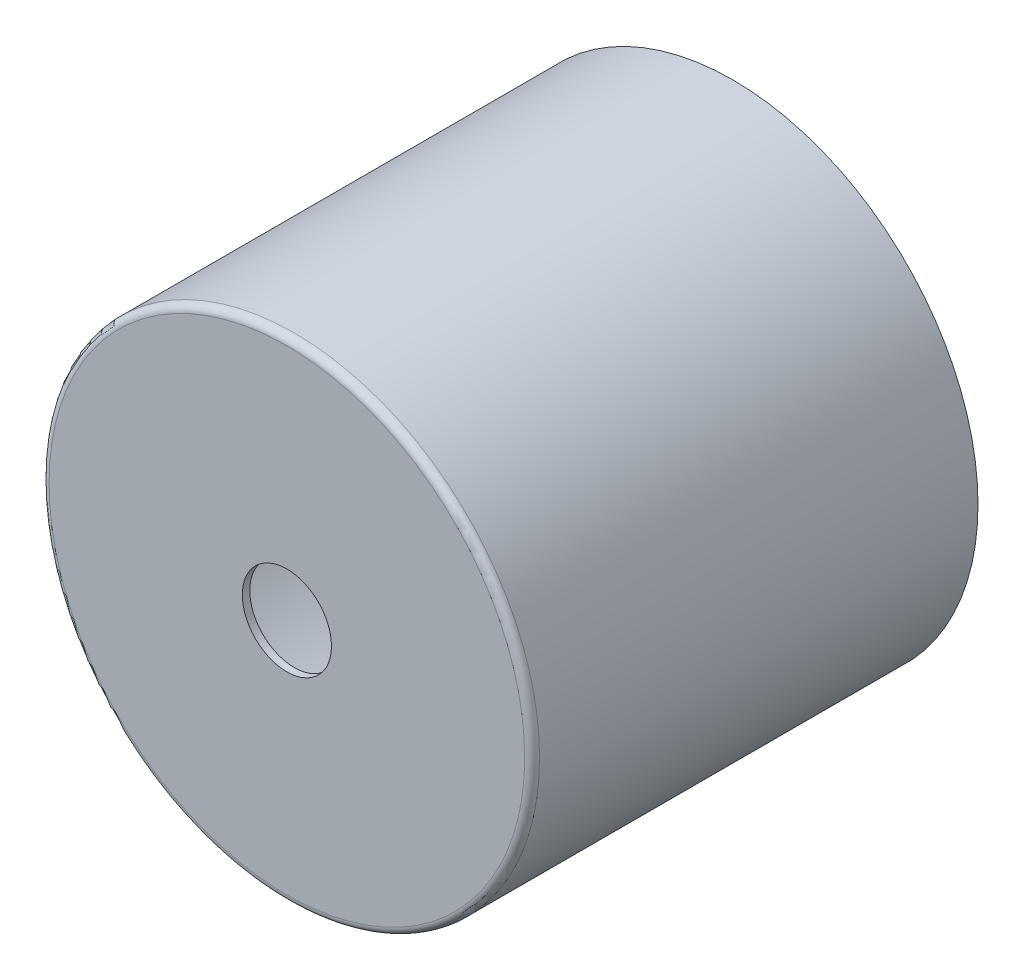
ISO-10303-21;
HEADER;
FILE_DESCRIPTION(('STEP AP214'),'2;1');
FILE_NAME('part.step','',(''),(''),'','','');
FILE_SCHEMA(('AUTOMOTIVE_DESIGN { 1 0 10303 214 1 1 1 1 }'));
ENDSEC;
DATA;
#1=APPLICATION_CONTEXT('core data for automotive mechanical design processes');
#2=APPLICATION_PROTOCOL_DEFINITION('international standard','automotive_design',2000,#1);
#3=PRODUCT_CONTEXT('',#1,'mechanical');
#4=PRODUCT('Part','Part','',(#3));
#5=PRODUCT_RELATED_PRODUCT_CATEGORY('part','',(#4));
#6=PRODUCT_DEFINITION_FORMATION('','',#4);
#7=PRODUCT_DEFINITION_CONTEXT('part definition',#1,'design');
#8=PRODUCT_DEFINITION('design','',#6,#7);
#9=PRODUCT_DEFINITION_SHAPE('','',#8);
#10=(LENGTH_UNIT() NAMED_UNIT(*) SI_UNIT(.MILLI.,.METRE.));
#11=(NAMED_UNIT(*) PLANE_ANGLE_UNIT() SI_UNIT($,.RADIAN.));
#12=(NAMED_UNIT(*) SI_UNIT($,.STERADIAN.) SOLID_ANGLE_UNIT());
#13=UNCERTAINTY_MEASURE_WITH_UNIT(LENGTH_MEASURE(1.E-05),#10,'distance_accuracy_value','');
#14=(GEOMETRIC_REPRESENTATION_CONTEXT(3) GLOBAL_UNCERTAINTY_ASSIGNED_CONTEXT((#13)) GLOBAL_UNIT_ASSIGNED_CONTEXT((#10,
#11,#12)) REPRESENTATION_CONTEXT('',''));
#15=CARTESIAN_POINT('',(0.,0.,0.));
#16=DIRECTION('',(0.,0.,1.));
#17=DIRECTION('',(1.,0.,0.));
#18=AXIS2_PLACEMENT_3D('',#15,#16,#17);
#19=CARTESIAN_POINT('',(0.,0.,-30.));
#20=DIRECTION('',(0.,0.,1.));
#21=DIRECTION('',(1.,0.,0.));
#22=AXIS2_PLACEMENT_3D('',#19,#20,#21);
#23=CYLINDRICAL_SURFACE('',#22,16.5);
#24=CARTESIAN_POINT('',(0.,0.,-0.5));
#25=DIRECTION('',(0.,0.,1.));
#26=DIRECTION('',(1.,0.,0.));
#27=AXIS2_PLACEMENT_3D('',#24,#25,#26);
#28=CIRCLE('',#27,16.5);
#29=CARTESIAN_POINT('',(16.5,0.,-0.5));
#30=VERTEX_POINT('',#29);
#31=EDGE_CURVE('E10',#30,#30,#28,.F.);
#32=ORIENTED_EDGE('',*,*,#31,.T.);
#33=EDGE_LOOP('',(#32));
#34=FACE_BOUND('',#33,.T.);
#35=CARTESIAN_POINT('',(0.,0.,-30.));
#36=DIRECTION('',(0.,0.,1.));
#37=DIRECTION('',(1.,0.,0.));
#38=AXIS2_PLACEMENT_3D('',#35,#36,#37);
#39=CIRCLE('',#38,16.5);
#40=CARTESIAN_POINT('',(16.5,0.,-30.));
#41=VERTEX_POINT('',#40);
#42=EDGE_CURVE('E43',#41,#41,#39,.T.);
#43=ORIENTED_EDGE('',*,*,#42,.T.);
#44=EDGE_LOOP('',(#43));
#45=FACE_BOUND('',#44,.T.);
#46=ADVANCED_FACE('F32',(#34,#45),#23,.T.);
#47=CARTESIAN_POINT('',(0.,0.,-30.));
#48=DIRECTION('',(0.,0.,1.));
#49=DIRECTION('',(1.,0.,0.));
#50=AXIS2_PLACEMENT_3D('',#47,#48,#49);
#51=PLANE('',#50);
#52=CARTESIAN_POINT('',(0.,0.,-30.));
#53=DIRECTION('',(0.,0.,1.));
#54=DIRECTION('',(1.,0.,0.));
#55=AXIS2_PLACEMENT_3D('',#52,#53,#54);
#56=CIRCLE('',#55,16.);
#57=CARTESIAN_POINT('',(16.,0.,-30.));
#58=VERTEX_POINT('',#57);
#59=EDGE_CURVE('E47',#58,#58,#56,.T.);
#60=ORIENTED_EDGE('',*,*,#59,.T.);
#61=EDGE_LOOP('',(#60));
#62=FACE_BOUND('',#61,.T.);
#63=ORIENTED_EDGE('',*,*,#42,.F.);
#64=EDGE_LOOP('',(#63));
#65=FACE_BOUND('',#64,.T.);
#66=ADVANCED_FACE('F68',(#62,#65),#51,.F.);
#67=CARTESIAN_POINT('',(0.,0.,0.));
#68=DIRECTION('',(0.,0.,1.));
#69=DIRECTION('',(1.,0.,0.));
#70=AXIS2_PLACEMENT_3D('',#67,#68,#69);
#71=PLANE('',#70);
#72=CARTESIAN_POINT('',(0.,0.,0.));
#73=DIRECTION('',(0.,0.,1.));
#74=DIRECTION('',(1.,0.,0.));
#75=AXIS2_PLACEMENT_3D('',#72,#73,#74);
#76=CIRCLE('',#75,16.);
#77=CARTESIAN_POINT('',(16.,0.,0.));
#78=VERTEX_POINT('',#77);
#79=EDGE_CURVE('E39',#78,#78,#76,.T.);
#80=ORIENTED_EDGE('',*,*,#79,.T.);
#81=EDGE_LOOP('',(#80));
#82=FACE_BOUND('',#81,.T.);
#83=CARTESIAN_POINT('',(0.,0.,0.));
#84=DIRECTION('',(0.,0.,1.));
#85=DIRECTION('',(1.,0.,0.));
#86=AXIS2_PLACEMENT_3D('',#83,#84,#85);
#87=CIRCLE('',#86,3.);
#88=CARTESIAN_POINT('',(3.,0.,0.));
#89=VERTEX_POINT('',#88);
#90=EDGE_CURVE('E53',#89,#89,#87,.T.);
#91=ORIENTED_EDGE('',*,*,#90,.F.);
#92=EDGE_LOOP('',(#91));
#93=FACE_BOUND('',#92,.T.);
#94=ADVANCED_FACE('F65',(#82,#93),#71,.T.);
#95=CARTESIAN_POINT('',(0.,0.,-30.));
#96=DIRECTION('',(0.,0.,1.));
#97=DIRECTION('',(1.,0.,0.));
#98=AXIS2_PLACEMENT_3D('',#95,#96,#97);
#99=CYLINDRICAL_SURFACE('',#98,16.);
#100=ORIENTED_EDGE('',*,*,#59,.F.);
#101=EDGE_LOOP('',(#100));
#102=FACE_BOUND('',#101,.T.);
#103=CARTESIAN_POINT('',(0.,0.,-0.5));
#104=DIRECTION('',(0.,0.,1.));
#105=DIRECTION('',(1.,0.,0.));
#106=AXIS2_PLACEMENT_3D('',#103,#104,#105);
#107=CIRCLE('',#106,16.);
#108=CARTESIAN_POINT('',(16.,0.,-0.5));
#109=VERTEX_POINT('',#108);
#110=EDGE_CURVE('E52',#109,#109,#107,.T.);
#111=ORIENTED_EDGE('',*,*,#110,.T.);
#112=EDGE_LOOP('',(#111));
#113=FACE_BOUND('',#112,.T.);
#114=ADVANCED_FACE('F67',(#102,#113),#99,.F.);
#115=CARTESIAN_POINT('',(0.,0.,-0.5));
#116=DIRECTION('',(0.,0.,1.));
#117=DIRECTION('',(1.,0.,0.));
#118=AXIS2_PLACEMENT_3D('',#115,#116,#117);
#119=PLANE('',#118);
#120=CARTESIAN_POINT('',(0.,0.,-0.5));
#121=DIRECTION('',(0.,0.,1.));
#122=DIRECTION('',(1.,0.,0.));
#123=AXIS2_PLACEMENT_3D('',#120,#121,#122);
#124=CIRCLE('',#123,3.);
#125=CARTESIAN_POINT('',(3.,0.,-0.5));
#126=VERTEX_POINT('',#125);
#127=EDGE_CURVE('E50',#126,#126,#124,.T.);
#128=ORIENTED_EDGE('',*,*,#127,.T.);
#129=EDGE_LOOP('',(#128));
#130=FACE_BOUND('',#129,.T.);
#131=ORIENTED_EDGE('',*,*,#110,.F.);
#132=EDGE_LOOP('',(#131));
#133=FACE_BOUND('',#132,.T.);
#134=ADVANCED_FACE('F74',(#130,#133),#119,.F.);
#135=CARTESIAN_POINT('',(0.,0.,-30.));
#136=DIRECTION('',(0.,0.,1.));
#137=DIRECTION('',(1.,0.,0.));
#138=AXIS2_PLACEMENT_3D('',#135,#136,#137);
#139=CYLINDRICAL_SURFACE('',#138,3.);
#140=ORIENTED_EDGE('',*,*,#90,.T.);
#141=EDGE_LOOP('',(#140));
#142=FACE_BOUND('',#141,.T.);
#143=ORIENTED_EDGE('',*,*,#127,.F.);
#144=EDGE_LOOP('',(#143));
#145=FACE_BOUND('',#144,.T.);
#146=ADVANCED_FACE('F62',(#142,#145),#139,.F.);
#147=CARTESIAN_POINT('',(0.,0.,-0.5));
#148=DIRECTION('',(0.,0.,1.));
#149=DIRECTION('',(1.,0.,0.));
#150=AXIS2_PLACEMENT_3D('',#147,#148,#149);
#151=TOROIDAL_SURFACE('',#150,16.,0.5);
#152=ORIENTED_EDGE('',*,*,#31,.F.);
#153=EDGE_LOOP('',(#152));
#154=FACE_BOUND('',#153,.T.);
#155=ORIENTED_EDGE('',*,*,#79,.F.);
#156=EDGE_LOOP('',(#155));
#157=FACE_BOUND('',#156,.T.);
#158=ADVANCED_FACE('F34',(#154,#157),#151,.T.);
#159=CLOSED_SHELL('',(#46,#66,#94,#114,#134,#146,#158));
#160=MANIFOLD_SOLID_BREP('B2',#159);
#161=ADVANCED_BREP_SHAPE_REPRESENTATION('',(#18,#160),#14);
#162=SHAPE_DEFINITION_REPRESENTATION(#9,#161);
ENDSEC;
END-ISO-10303-21;
